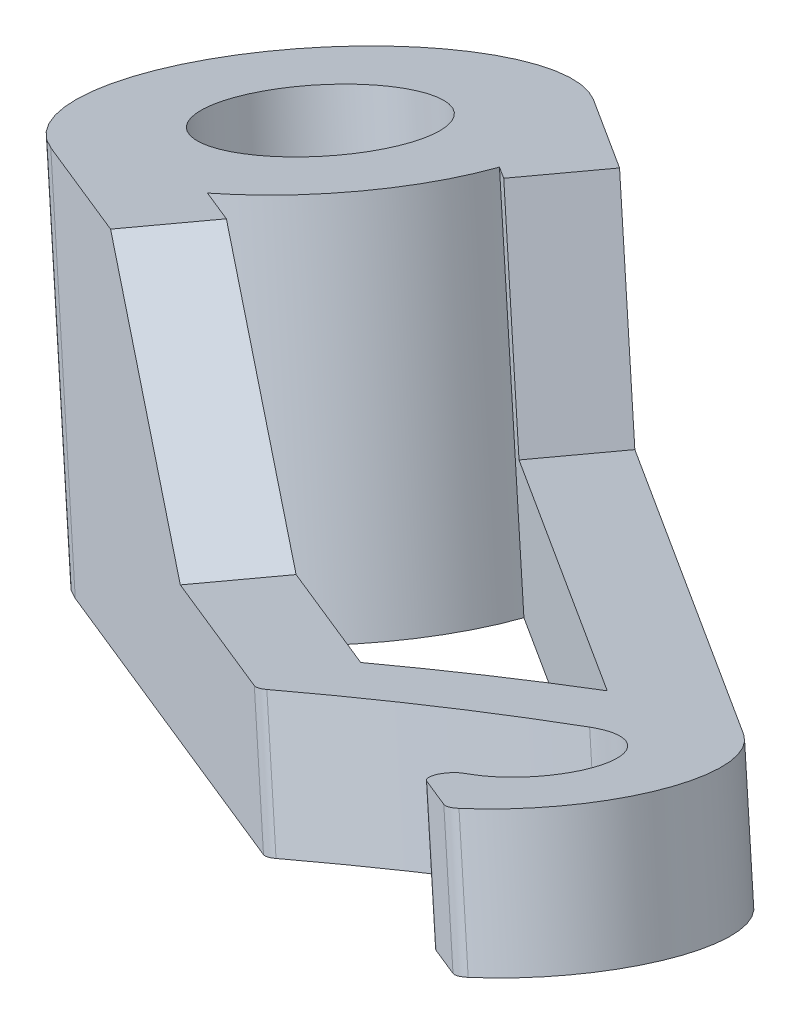
ISO-10303-21;
HEADER;
FILE_DESCRIPTION(('STEP AP214'),'2;1');
FILE_NAME('part.step','',(''),(''),'','','');
FILE_SCHEMA(('AUTOMOTIVE_DESIGN { 1 0 10303 214 1 1 1 1 }'));
ENDSEC;
DATA;
#1=APPLICATION_CONTEXT('core data for automotive mechanical design processes');
#2=APPLICATION_PROTOCOL_DEFINITION('international standard','automotive_design',2000,#1);
#3=PRODUCT_CONTEXT('',#1,'mechanical');
#4=PRODUCT('Part','Part','',(#3));
#5=PRODUCT_RELATED_PRODUCT_CATEGORY('part','',(#4));
#6=PRODUCT_DEFINITION_FORMATION('','',#4);
#7=PRODUCT_DEFINITION_CONTEXT('part definition',#1,'design');
#8=PRODUCT_DEFINITION('design','',#6,#7);
#9=PRODUCT_DEFINITION_SHAPE('','',#8);
#10=(LENGTH_UNIT() NAMED_UNIT(*) SI_UNIT(.MILLI.,.METRE.));
#11=(NAMED_UNIT(*) PLANE_ANGLE_UNIT() SI_UNIT($,.RADIAN.));
#12=(NAMED_UNIT(*) SI_UNIT($,.STERADIAN.) SOLID_ANGLE_UNIT());
#13=UNCERTAINTY_MEASURE_WITH_UNIT(LENGTH_MEASURE(1.E-05),#10,'distance_accuracy_value','');
#14=(GEOMETRIC_REPRESENTATION_CONTEXT(3) GLOBAL_UNCERTAINTY_ASSIGNED_CONTEXT((#13)) GLOBAL_UNIT_ASSIGNED_CONTEXT((#10,
#11,#12)) REPRESENTATION_CONTEXT('',''));
#15=CARTESIAN_POINT('',(0.,0.,0.));
#16=DIRECTION('',(0.,0.,1.));
#17=DIRECTION('',(1.,0.,0.));
#18=AXIS2_PLACEMENT_3D('',#15,#16,#17);
#19=CARTESIAN_POINT('',(-4.6893412063261,5.61280139034177,6.03908326318181));
#20=DIRECTION('',(0.275946414079952,-0.93969262078591,0.202067699043971));
#21=DIRECTION('',(0.959485309616609,0.28175865670804,0.));
#22=AXIS2_PLACEMENT_3D('',#19,#20,#21);
#23=CYLINDRICAL_SURFACE('',#22,8.54196324430797);
#24=CARTESIAN_POINT('',(-4.34440818872616,4.43818561435938,6.29166788698678));
#25=DIRECTION('',(-0.275946414079952,0.93969262078591,-0.202067699043971));
#26=DIRECTION('',(-0.959485309616609,-0.28175865670804,0.));
#27=AXIS2_PLACEMENT_3D('',#24,#25,#26);
#28=CIRCLE('',#27,8.54196324430797);
#29=CARTESIAN_POINT('',(-5.25117296309972,2.39888330321453,-1.95358285479318));
#30=VERTEX_POINT('',#29);
#31=CARTESIAN_POINT('',(-6.78262623869362,2.03906699651033,-1.53549371000427));
#32=VERTEX_POINT('',#31);
#33=EDGE_CURVE('E197',#30,#32,#28,.T.);
#34=ORIENTED_EDGE('',*,*,#33,.T.);
#35=DIRECTION('',(0.275946414079952,-0.93969262078591,0.202067699043971));
#36=VECTOR('',#35,1.);
#37=CARTESIAN_POINT('',(-7.12755925629356,3.21368277249272,-1.78807833380923));
#38=LINE('',#37,#36);
#39=CARTESIAN_POINT('',(-6.57566642813365,1.3342975309209,-1.38394293572129));
#40=VERTEX_POINT('',#39);
#41=EDGE_CURVE('E285',#32,#40,#38,.T.);
#42=ORIENTED_EDGE('',*,*,#41,.T.);
#43=CARTESIAN_POINT('',(-4.1374483781662,3.73341614876995,6.44321866126975));
#44=DIRECTION('',(-0.275946414079952,0.93969262078591,-0.202067699043971));
#45=DIRECTION('',(-0.959485309616609,-0.28175865670804,0.));
#46=AXIS2_PLACEMENT_3D('',#43,#44,#45);
#47=CIRCLE('',#46,8.54196324430797);
#48=CARTESIAN_POINT('',(-5.04421315253975,1.6941138376251,-1.80203208051021));
#49=VERTEX_POINT('',#48);
#50=EDGE_CURVE('E256',#49,#40,#47,.T.);
#51=ORIENTED_EDGE('',*,*,#50,.F.);
#52=DIRECTION('',(0.275946414079952,-0.93969262078591,0.202067699043971));
#53=VECTOR('',#52,1.);
#54=CARTESIAN_POINT('',(-5.59610598069966,3.57349907919692,-2.20616747859815));
#55=LINE('',#54,#53);
#56=EDGE_CURVE('E264',#30,#49,#55,.T.);
#57=ORIENTED_EDGE('',*,*,#56,.F.);
#58=EDGE_LOOP('',(#34,#42,#51,#57));
#59=FACE_BOUND('',#58,.T.);
#60=ADVANCED_FACE('F37',(#59),#23,.F.);
#61=CARTESIAN_POINT('',(-5.5518928281599,3.67293389041309,-1.80413539808794));
#62=DIRECTION('',(0.275946414079952,-0.93969262078591,0.202067699043971));
#63=DIRECTION('',(0.959485309616609,0.28175865670804,0.));
#64=AXIS2_PLACEMENT_3D('',#61,#62,#63);
#65=CYLINDRICAL_SURFACE('',#64,0.416499553779431);
#66=DIRECTION('',(0.275946414079952,-0.93969262078591,0.202067699043971));
#67=VECTOR('',#66,1.);
#68=CARTESIAN_POINT('',(-5.50767967562015,3.77236870162925,-1.40210331757773));
#69=LINE('',#68,#67);
#70=CARTESIAN_POINT('',(-5.16274665802021,2.59775292564687,-1.14951869377277));
#71=VERTEX_POINT('',#70);
#72=CARTESIAN_POINT('',(-4.95578684746025,1.89298346005744,-0.997967919489788));
#73=VERTEX_POINT('',#72);
#74=EDGE_CURVE('E266',#71,#73,#69,.T.);
#75=ORIENTED_EDGE('',*,*,#74,.F.);
#76=CARTESIAN_POINT('',(-5.20695981055996,2.4983181144307,-1.55155077428298));
#77=DIRECTION('',(-0.275946414079952,0.93969262078591,-0.202067699043971));
#78=DIRECTION('',(-0.959485309616609,-0.28175865670804,0.));
#79=AXIS2_PLACEMENT_3D('',#76,#77,#78);
#80=CIRCLE('',#79,0.416499553779431);
#81=EDGE_CURVE('E352',#71,#30,#80,.T.);
#82=ORIENTED_EDGE('',*,*,#81,.T.);
#83=ORIENTED_EDGE('',*,*,#56,.T.);
#84=CARTESIAN_POINT('',(-5.,1.79354864884127,-1.4));
#85=DIRECTION('',(-0.275946414079952,0.93969262078591,-0.202067699043971));
#86=DIRECTION('',(0.959485309616609,0.28175865670804,0.));
#87=AXIS2_PLACEMENT_3D('',#84,#85,#86);
#88=CIRCLE('',#87,0.416499553779431);
#89=EDGE_CURVE('E253',#73,#49,#88,.T.);
#90=ORIENTED_EDGE('',*,*,#89,.F.);
#91=EDGE_LOOP('',(#75,#82,#83,#90));
#92=FACE_BOUND('',#91,.T.);
#93=ADVANCED_FACE('F367',(#92),#65,.F.);
#94=CARTESIAN_POINT('',(-5.50767967562015,3.77236870162925,-1.40210331757773));
#95=DIRECTION('',(-0.106154141435565,-0.238739298311052,-0.965264132607249));
#96=DIRECTION('',(0.,0.970749170132312,-0.240095915599219));
#97=AXIS2_PLACEMENT_3D('',#94,#95,#96);
#98=PLANE('',#97);
#99=DIRECTION('',(0.95529308320143,0.244910852929093,-0.165631516641763));
#100=VECTOR('',#99,1.);
#101=CARTESIAN_POINT('',(-4.95578684746025,1.89298346005744,-0.997967919489788));
#102=LINE('',#101,#100);
#103=CARTESIAN_POINT('',(-4.99227579631677,1.88362869789692,-0.991641358514892));
#104=VERTEX_POINT('',#103);
#105=EDGE_CURVE('E251',#104,#73,#102,.T.);
#106=ORIENTED_EDGE('',*,*,#105,.F.);
#107=DIRECTION('',(0.275946414079952,-0.93969262078591,0.202067699043971));
#108=VECTOR('',#107,1.);
#109=CARTESIAN_POINT('',(-5.54416862447668,3.76301393946874,-1.39577675660283));
#110=LINE('',#109,#108);
#111=CARTESIAN_POINT('',(-5.19923560687674,2.58839816348635,-1.14319213279787));
#112=VERTEX_POINT('',#111);
#113=EDGE_CURVE('E12',#104,#112,#110,.F.);
#114=ORIENTED_EDGE('',*,*,#113,.T.);
#115=DIRECTION('',(0.95529308320143,0.244910852929093,-0.165631516641763));
#116=VECTOR('',#115,1.);
#117=CARTESIAN_POINT('',(-5.16274665802021,2.59775292564687,-1.14951869377277));
#118=LINE('',#117,#116);
#119=EDGE_CURVE('E312',#112,#71,#118,.T.);
#120=ORIENTED_EDGE('',*,*,#119,.T.);
#121=ORIENTED_EDGE('',*,*,#74,.T.);
#122=EDGE_LOOP('',(#106,#114,#120,#121));
#123=FACE_BOUND('',#122,.T.);
#124=ADVANCED_FACE('F371',(#123),#98,.T.);
#125=CARTESIAN_POINT('',(-5.24071782991251,3.94052830678506,-0.984663140552532));
#126=DIRECTION('',(-0.557739430019936,0.0146718646886425,0.829886416678569));
#127=DIRECTION('',(0.829975753276417,0.,0.557799470215995));
#128=AXIS2_PLACEMENT_3D('',#125,#126,#127);
#129=PLANE('',#128);
#130=DIRECTION('',(-0.78280285178163,-0.341705304066336,-0.520054978262376));
#131=VECTOR('',#130,1.);
#132=CARTESIAN_POINT('',(-4.68882500175261,2.06114306521324,-0.580527742464591));
#133=LINE('',#132,#131);
#134=CARTESIAN_POINT('',(-4.73215915963464,2.04222704879628,-0.609316784921538));
#135=VERTEX_POINT('',#134);
#136=CARTESIAN_POINT('',(-5.03743432517521,1.90896981419689,-0.812126303586311));
#137=VERTEX_POINT('',#136);
#138=EDGE_CURVE('E248',#135,#137,#133,.T.);
#139=ORIENTED_EDGE('',*,*,#138,.F.);
#140=DIRECTION('',(0.275946414079952,-0.93969262078591,0.202067699043971));
#141=VECTOR('',#140,1.);
#142=CARTESIAN_POINT('',(-5.28405198779455,3.9216122903681,-1.01345218300948));
#143=LINE('',#142,#141);
#144=CARTESIAN_POINT('',(-4.93911897019461,2.74699651438572,-0.760867559204516));
#145=VERTEX_POINT('',#144);
#146=EDGE_CURVE('E45',#135,#145,#143,.F.);
#147=ORIENTED_EDGE('',*,*,#146,.T.);
#148=DIRECTION('',(-0.78280285178163,-0.341705304066336,-0.520054978262376));
#149=VECTOR('',#148,1.);
#150=CARTESIAN_POINT('',(-4.89578481231257,2.76591253080267,-0.732078516747569));
#151=LINE('',#150,#149);
#152=CARTESIAN_POINT('',(-5.24439413573518,2.61373927978632,-0.963677077869289));
#153=VERTEX_POINT('',#152);
#154=EDGE_CURVE('E309',#145,#153,#151,.T.);
#155=ORIENTED_EDGE('',*,*,#154,.T.);
#156=DIRECTION('',(0.275946414079952,-0.93969262078591,0.202067699043971));
#157=VECTOR('',#156,1.);
#158=CARTESIAN_POINT('',(-5.58932715333512,3.7883550557687,-1.21626170167425));
#159=LINE('',#158,#157);
#160=EDGE_CURVE('E303',#153,#137,#159,.T.);
#161=ORIENTED_EDGE('',*,*,#160,.T.);
#162=EDGE_LOOP('',(#139,#147,#155,#161));
#163=FACE_BOUND('',#162,.T.);
#164=ADVANCED_FACE('F308',(#163),#129,.T.);
#165=CARTESIAN_POINT('',(-5.5518928281599,3.67293389041309,-1.80413539808794));
#166=DIRECTION('',(0.275946414079952,-0.93969262078591,0.202067699043971));
#167=DIRECTION('',(0.959485309616609,0.28175865670804,0.));
#168=AXIS2_PLACEMENT_3D('',#165,#166,#167);
#169=CYLINDRICAL_SURFACE('',#168,0.91649955377943);
#170=CARTESIAN_POINT('',(-5.20695981055996,2.4983181144307,-1.55155077428298));
#171=DIRECTION('',(-0.275946414079952,0.93969262078591,-0.202067699043971));
#172=DIRECTION('',(-0.959485309616609,-0.28175865670804,0.));
#173=AXIS2_PLACEMENT_3D('',#170,#171,#172);
#174=CIRCLE('',#173,0.91649955377943);
#175=CARTESIAN_POINT('',(-4.63520813791761,2.5122173303551,-2.26770597303898));
#176=VERTEX_POINT('',#175);
#177=CARTESIAN_POINT('',(-4.84371061687733,2.77580628426568,-0.757181986522246));
#178=VERTEX_POINT('',#177);
#179=EDGE_CURVE('E172',#176,#178,#174,.F.);
#180=ORIENTED_EDGE('',*,*,#179,.T.);
#181=DIRECTION('',(0.275946414079952,-0.93969262078591,0.202067699043971));
#182=VECTOR('',#181,1.);
#183=CARTESIAN_POINT('',(-5.18864363447727,3.95042206024806,-1.00976661032721));
#184=LINE('',#183,#182);
#185=CARTESIAN_POINT('',(-4.63675080631737,2.07103681867624,-0.605631212239268));
#186=VERTEX_POINT('',#185);
#187=EDGE_CURVE('E300',#178,#186,#184,.T.);
#188=ORIENTED_EDGE('',*,*,#187,.T.);
#189=CARTESIAN_POINT('',(-5.,1.79354864884127,-1.4));
#190=DIRECTION('',(0.275946414079952,-0.93969262078591,0.202067699043971));
#191=DIRECTION('',(-0.959485309616609,-0.28175865670804,0.));
#192=AXIS2_PLACEMENT_3D('',#189,#190,#191);
#193=CIRCLE('',#192,0.91649955377943);
#194=CARTESIAN_POINT('',(-4.42824832735765,1.80744786476567,-2.116155198756));
#195=VERTEX_POINT('',#194);
#196=EDGE_CURVE('E245',#195,#186,#193,.T.);
#197=ORIENTED_EDGE('',*,*,#196,.F.);
#198=DIRECTION('',(0.275946414079952,-0.93969262078591,0.202067699043971));
#199=VECTOR('',#198,1.);
#200=CARTESIAN_POINT('',(-4.98014115551755,3.68683310633749,-2.52029059684395));
#201=LINE('',#200,#199);
#202=EDGE_CURVE('E269',#176,#195,#201,.T.);
#203=ORIENTED_EDGE('',*,*,#202,.F.);
#204=EDGE_LOOP('',(#180,#188,#197,#203));
#205=FACE_BOUND('',#204,.T.);
#206=ADVANCED_FACE('F318',(#205),#169,.T.);
#207=CARTESIAN_POINT('',(-4.6893412063261,5.61280139034177,6.03908326318181));
#208=DIRECTION('',(0.275946414079952,-0.93969262078591,0.202067699043971));
#209=DIRECTION('',(0.959485309616609,0.28175865670804,0.));
#210=AXIS2_PLACEMENT_3D('',#207,#208,#209);
#211=CYLINDRICAL_SURFACE('',#210,9.04196324430798);
#212=CARTESIAN_POINT('',(-4.34440818872616,4.43818561435938,6.29166788698678));
#213=DIRECTION('',(-0.275946414079952,0.93969262078591,-0.202067699043971));
#214=DIRECTION('',(-0.959485309616609,-0.28175865670804,0.));
#215=AXIS2_PLACEMENT_3D('',#212,#213,#214);
#216=CIRCLE('',#215,9.04196324430798);
#217=CARTESIAN_POINT('',(-5.57590640669709,2.21081786946406,-2.38469911652056));
#218=VERTEX_POINT('',#217);
#219=CARTESIAN_POINT('',(-6.74114691236747,1.93829354223655,-2.06077381767373));
#220=VERTEX_POINT('',#219);
#221=EDGE_CURVE('E185',#218,#220,#216,.T.);
#222=ORIENTED_EDGE('',*,*,#221,.F.);
#223=DIRECTION('',(0.275946414079952,-0.93969262078591,0.202067699043971));
#224=VECTOR('',#223,1.);
#225=CARTESIAN_POINT('',(-5.92083942429703,3.38543364544645,-2.63728374032552));
#226=LINE('',#225,#224);
#227=CARTESIAN_POINT('',(-5.36894659613713,1.50604840387463,-2.23314834223758));
#228=VERTEX_POINT('',#227);
#229=EDGE_CURVE('E222',#218,#228,#226,.T.);
#230=ORIENTED_EDGE('',*,*,#229,.T.);
#231=CARTESIAN_POINT('',(-4.1374483781662,3.73341614876995,6.44321866126975));
#232=DIRECTION('',(-0.275946414079952,0.93969262078591,-0.202067699043971));
#233=DIRECTION('',(-0.959485309616609,-0.28175865670804,0.));
#234=AXIS2_PLACEMENT_3D('',#231,#232,#233);
#235=CIRCLE('',#234,9.04196324430798);
#236=CARTESIAN_POINT('',(-6.5341871018075,1.23352407664711,-1.90922304339075));
#237=VERTEX_POINT('',#236);
#238=EDGE_CURVE('E212',#228,#237,#235,.T.);
#239=ORIENTED_EDGE('',*,*,#238,.T.);
#240=DIRECTION('',(0.275946414079952,-0.93969262078591,0.202067699043971));
#241=VECTOR('',#240,1.);
#242=CARTESIAN_POINT('',(-7.08607992996741,3.11290931821893,-2.31335844147869));
#243=LINE('',#242,#241);
#244=EDGE_CURVE('E220',#220,#237,#243,.T.);
#245=ORIENTED_EDGE('',*,*,#244,.F.);
#246=EDGE_LOOP('',(#222,#230,#239,#245));
#247=FACE_BOUND('',#246,.T.);
#248=ADVANCED_FACE('F404',(#247),#211,.T.);
#249=CARTESIAN_POINT('',(-9.94464078527404,1.6912741627427,-5.02081960517815));
#250=DIRECTION('',(0.275946414079952,-0.93969262078591,0.202067699043971));
#251=DIRECTION('',(0.959485309616609,0.28175865670804,0.));
#252=AXIS2_PLACEMENT_3D('',#249,#250,#251);
#253=CYLINDRICAL_SURFACE('',#252,1.17341117996067);
#254=CARTESIAN_POINT('',(-9.39274795711414,-0.188111078829119,-4.6166842070902));
#255=DIRECTION('',(0.275946414079952,-0.93969262078591,0.202067699043971));
#256=DIRECTION('',(-0.959485309616609,-0.28175865670804,0.));
#257=AXIS2_PLACEMENT_3D('',#254,#255,#256);
#258=CIRCLE('',#257,1.17341117996067);
#259=CARTESIAN_POINT('',(-10.0472056398044,-0.170894948772595,-3.64288620766207));
#260=VERTEX_POINT('',#259);
#261=CARTESIAN_POINT('',(-8.66072380928655,-0.170315657880881,-5.5335908366045));
#262=VERTEX_POINT('',#261);
#263=EDGE_CURVE('E229',#260,#262,#258,.T.);
#264=ORIENTED_EDGE('',*,*,#263,.F.);
#265=DIRECTION('',(0.275946414079952,-0.93969262078591,0.202067699043971));
#266=VECTOR('',#265,1.);
#267=CARTESIAN_POINT('',(-10.5990984679643,1.70849029279922,-4.04702160575001));
#268=LINE('',#267,#266);
#269=CARTESIAN_POINT('',(-10.5990984679643,1.70849029279922,-4.04702160575001));
#270=VERTEX_POINT('',#269);
#271=EDGE_CURVE('E260',#270,#260,#268,.T.);
#272=ORIENTED_EDGE('',*,*,#271,.F.);
#273=CARTESIAN_POINT('',(-9.94464078527404,1.6912741627427,-5.02081960517815));
#274=DIRECTION('',(0.275946414079952,-0.93969262078591,0.202067699043971));
#275=DIRECTION('',(-0.959485309616609,-0.28175865670804,0.));
#276=AXIS2_PLACEMENT_3D('',#273,#274,#275);
#277=CIRCLE('',#276,1.17341117996067);
#278=CARTESIAN_POINT('',(-9.21261663744646,1.70906958369094,-5.93772623469244));
#279=VERTEX_POINT('',#278);
#280=EDGE_CURVE('E232',#270,#279,#277,.T.);
#281=ORIENTED_EDGE('',*,*,#280,.T.);
#282=DIRECTION('',(0.275946414079952,-0.93969262078591,0.202067699043971));
#283=VECTOR('',#282,1.);
#284=CARTESIAN_POINT('',(-9.21261663744646,1.70906958369094,-5.93772623469244));
#285=LINE('',#284,#283);
#286=EDGE_CURVE('E239',#279,#262,#285,.T.);
#287=ORIENTED_EDGE('',*,*,#286,.T.);
#288=EDGE_LOOP('',(#264,#272,#281,#287));
#289=FACE_BOUND('',#288,.T.);
#290=ADVANCED_FACE('F329',(#289),#253,.T.);
#291=CARTESIAN_POINT('',(-10.5990984679643,1.70849029279922,-4.04702160575001));
#292=DIRECTION('',(-0.557739430019936,0.0146718646886426,0.829886416678569));
#293=DIRECTION('',(0.829975753276417,0.,0.557799470215994));
#294=AXIS2_PLACEMENT_3D('',#291,#292,#293);
#295=PLANE('',#294);
#296=DIRECTION('',(-0.78280285178163,-0.341705304066336,-0.520054978262376));
#297=VECTOR('',#296,1.);
#298=CARTESIAN_POINT('',(-10.0472056398044,-0.170894948772595,-3.64288620766207));
#299=LINE('',#298,#297);
#300=CARTESIAN_POINT('',(-6.65998437185576,1.30767845022574,-1.39258617507571));
#301=VERTEX_POINT('',#300);
#302=EDGE_CURVE('E235',#301,#260,#299,.T.);
#303=ORIENTED_EDGE('',*,*,#302,.F.);
#304=DIRECTION('',(0.275946414079952,-0.93969262078591,0.202067699043971));
#305=VECTOR('',#304,1.);
#306=CARTESIAN_POINT('',(-7.21187720001567,3.18706369179756,-1.79672157316365));
#307=LINE('',#306,#305);
#308=CARTESIAN_POINT('',(-6.86694418241573,2.01244791581518,-1.54413694935869));
#309=VERTEX_POINT('',#308);
#310=EDGE_CURVE('E294',#301,#309,#307,.F.);
#311=ORIENTED_EDGE('',*,*,#310,.T.);
#312=DIRECTION('',(-0.78280285178163,-0.341705304066336,-0.520054978262376));
#313=VECTOR('',#312,1.);
#314=CARTESIAN_POINT('',(-10.2541654503644,0.533874516816838,-3.79443698194505));
#315=LINE('',#314,#313);
#316=CARTESIAN_POINT('',(-8.19892327742724,1.4310188616989,-2.42903709723831));
#317=VERTEX_POINT('',#316);
#318=EDGE_CURVE('E193',#309,#317,#315,.T.);
#319=ORIENTED_EDGE('',*,*,#318,.T.);
#320=DIRECTION('',(-0.748813741477248,0.422423611327083,-0.510721326329958));
#321=VECTOR('',#320,1.);
#322=CARTESIAN_POINT('',(-9.68012484523465,2.26659983560329,-3.43927660991103));
#323=LINE('',#322,#321);
#324=CARTESIAN_POINT('',(-9.52326143000759,2.17810945852421,-3.33228940195814));
#325=VERTEX_POINT('',#324);
#326=EDGE_CURVE('E282',#317,#325,#323,.T.);
#327=ORIENTED_EDGE('',*,*,#326,.T.);
#328=DIRECTION('',(-0.78280285178163,-0.341705304066336,-0.520054978262376));
#329=VECTOR('',#328,1.);
#330=CARTESIAN_POINT('',(-10.5990984679643,1.70849029279922,-4.04702160575001));
#331=LINE('',#330,#329);
#332=EDGE_CURVE('E237',#325,#270,#331,.T.);
#333=ORIENTED_EDGE('',*,*,#332,.T.);
#334=ORIENTED_EDGE('',*,*,#271,.T.);
#335=EDGE_LOOP('',(#303,#311,#319,#327,#333,#334));
#336=FACE_BOUND('',#335,.T.);
#337=ADVANCED_FACE('F332',(#336),#295,.T.);
#338=CARTESIAN_POINT('',(-4.98014115551755,3.68683310633749,-2.52029059684395));
#339=DIRECTION('',(0.623842827074579,0.015165545762768,-0.781402670413477));
#340=DIRECTION('',(-0.78149254479295,0.,-0.623914579436191));
#341=AXIS2_PLACEMENT_3D('',#338,#339,#340);
#342=PLANE('',#341);
#343=DIRECTION('',(-0.275946414079952,0.939692620785909,-0.202067699043971));
#344=VECTOR('',#343,1.);
#345=CARTESIAN_POINT('',(-8.39184014725785,2.09260442269279,-5.27500512969022));
#346=LINE('',#345,#344);
#347=CARTESIAN_POINT('',(-8.04690712965792,0.917988646710401,-5.02242050588526));
#348=VERTEX_POINT('',#347);
#349=CARTESIAN_POINT('',(-8.39184014725785,2.09260442269279,-5.27500512969022));
#350=VERTEX_POINT('',#349);
#351=EDGE_CURVE('E180',#348,#350,#346,.T.);
#352=ORIENTED_EDGE('',*,*,#351,.F.);
#353=DIRECTION('',(0.73121385631292,0.341683749485143,0.590405379103004));
#354=VECTOR('',#353,1.);
#355=CARTESIAN_POINT('',(-4.63520813791761,2.5122173303551,-2.26770597303898));
#356=LINE('',#355,#354);
#357=EDGE_CURVE('E166',#348,#176,#356,.T.);
#358=ORIENTED_EDGE('',*,*,#357,.T.);
#359=ORIENTED_EDGE('',*,*,#202,.T.);
#360=DIRECTION('',(0.73121385631292,0.341683749485143,0.590405379103004));
#361=VECTOR('',#360,1.);
#362=CARTESIAN_POINT('',(-4.42824832735765,1.80744786476567,-2.116155198756));
#363=LINE('',#362,#361);
#364=EDGE_CURVE('E242',#262,#195,#363,.T.);
#365=ORIENTED_EDGE('',*,*,#364,.F.);
#366=ORIENTED_EDGE('',*,*,#286,.F.);
#367=DIRECTION('',(0.73121385631292,0.341683749485143,0.590405379103004));
#368=VECTOR('',#367,1.);
#369=CARTESIAN_POINT('',(-4.98014115551755,3.68683310633749,-2.52029059684395));
#370=LINE('',#369,#368);
#371=EDGE_CURVE('E191',#279,#350,#370,.T.);
#372=ORIENTED_EDGE('',*,*,#371,.T.);
#373=EDGE_LOOP('',(#352,#358,#359,#365,#366,#372));
#374=FACE_BOUND('',#373,.T.);
#375=ADVANCED_FACE('F189',(#374),#342,.T.);
#376=CARTESIAN_POINT('',(-9.94464078527404,1.6912741627427,-5.02081960517815));
#377=DIRECTION('',(-0.275946414079952,0.93969262078591,-0.202067699043971));
#378=DIRECTION('',(-0.959485309616609,-0.28175865670804,0.));
#379=AXIS2_PLACEMENT_3D('',#376,#377,#378);
#380=PLANE('',#379);
#381=DIRECTION('',(-0.590806427595597,0.,0.806813339696196));
#382=VECTOR('',#381,1.);
#383=CARTESIAN_POINT('',(-6.91116516675307,2.09260442269279,-7.29703513855021));
#384=LINE('',#383,#382);
#385=CARTESIAN_POINT('',(-8.68753419087048,2.09260442269279,-4.87120129866847));
#386=VERTEX_POINT('',#385);
#387=EDGE_CURVE('E186',#350,#386,#384,.T.);
#388=ORIENTED_EDGE('',*,*,#387,.F.);
#389=ORIENTED_EDGE('',*,*,#371,.F.);
#390=ORIENTED_EDGE('',*,*,#280,.F.);
#391=ORIENTED_EDGE('',*,*,#332,.F.);
#392=DIRECTION('',(0.590806427595597,0.,-0.806813339696196));
#393=VECTOR('',#392,1.);
#394=CARTESIAN_POINT('',(-6.72162603133702,2.17810945852421,-7.15824102846908));
#395=LINE('',#394,#393);
#396=CARTESIAN_POINT('',(-9.22758603861135,2.17810945852421,-3.73606776125803));
#397=VERTEX_POINT('',#396);
#398=EDGE_CURVE('E277',#325,#397,#395,.T.);
#399=ORIENTED_EDGE('',*,*,#398,.T.);
#400=DIRECTION('',(-0.78280285178163,-0.341705304066336,-0.520054978262376));
#401=VECTOR('',#400,1.);
#402=CARTESIAN_POINT('',(-7.08607992996741,3.11290931821893,-2.31335844147869));
#403=LINE('',#402,#401);
#404=CARTESIAN_POINT('',(-9.56799994183853,2.0295136325817,-3.96222169598131));
#405=VERTEX_POINT('',#404);
#406=EDGE_CURVE('E207',#397,#405,#403,.T.);
#407=ORIENTED_EDGE('',*,*,#406,.T.);
#408=CARTESIAN_POINT('',(-9.94464078527404,1.6912741627427,-5.02081960517815));
#409=DIRECTION('',(-0.275946414079952,0.93969262078591,-0.202067699043971));
#410=DIRECTION('',(-0.959485309616609,-0.28175865670804,0.));
#411=AXIS2_PLACEMENT_3D('',#408,#409,#410);
#412=CIRCLE('',#411,1.17341117996067);
#413=CARTESIAN_POINT('',(-8.82188331671212,2.02982537021545,-4.97967906599999));
#414=VERTEX_POINT('',#413);
#415=EDGE_CURVE('E201',#405,#414,#412,.T.);
#416=ORIENTED_EDGE('',*,*,#415,.T.);
#417=DIRECTION('',(0.73121385631292,0.341683749485143,0.590405379103004));
#418=VECTOR('',#417,1.);
#419=CARTESIAN_POINT('',(-8.82188331671212,2.02982537021545,-4.97967906599999));
#420=LINE('',#419,#418);
#421=EDGE_CURVE('E203',#414,#386,#420,.T.);
#422=ORIENTED_EDGE('',*,*,#421,.T.);
#423=EDGE_LOOP('',(#388,#389,#390,#391,#399,#407,#416,#422));
#424=FACE_BOUND('',#423,.T.);
#425=CARTESIAN_POINT('',(-9.94464078527404,1.6912741627427,-5.02081960517815));
#426=DIRECTION('',(0.275946414079952,-0.93969262078591,0.202067699043971));
#427=DIRECTION('',(0.959485309616609,0.28175865670804,0.));
#428=AXIS2_PLACEMENT_3D('',#425,#426,#427);
#429=CIRCLE('',#428,0.573411179960669);
#430=CARTESIAN_POINT('',(-9.39446118173185,1.85283772654979,-5.02081960517815));
#431=VERTEX_POINT('',#430);
#432=EDGE_CURVE('E226',#431,#431,#429,.T.);
#433=ORIENTED_EDGE('',*,*,#432,.T.);
#434=EDGE_LOOP('',(#433));
#435=FACE_BOUND('',#434,.T.);
#436=ADVANCED_FACE('F326',(#424,#435),#380,.T.);
#437=CARTESIAN_POINT('',(-9.39274795711414,-0.188111078829119,-4.6166842070902));
#438=DIRECTION('',(-0.275946414079952,0.93969262078591,-0.202067699043971));
#439=DIRECTION('',(-0.959485309616609,-0.28175865670804,0.));
#440=AXIS2_PLACEMENT_3D('',#437,#438,#439);
#441=PLANE('',#440);
#442=DIRECTION('',(0.73121385631292,0.341683749485143,0.590405379103004));
#443=VECTOR('',#442,1.);
#444=CARTESIAN_POINT('',(-8.26999048855222,0.150440128643633,-4.57554366791205));
#445=LINE('',#444,#443);
#446=CARTESIAN_POINT('',(-8.26999048855222,0.150440128643633,-4.57554366791205));
#447=VERTEX_POINT('',#446);
#448=EDGE_CURVE('E195',#447,#228,#445,.T.);
#449=ORIENTED_EDGE('',*,*,#448,.F.);
#450=CARTESIAN_POINT('',(-9.39274795711414,-0.188111078829119,-4.6166842070902));
#451=DIRECTION('',(-0.275946414079952,0.93969262078591,-0.202067699043971));
#452=DIRECTION('',(-0.959485309616609,-0.28175865670804,0.));
#453=AXIS2_PLACEMENT_3D('',#450,#451,#452);
#454=CIRCLE('',#453,1.17341117996067);
#455=CARTESIAN_POINT('',(-9.01610711367862,0.150128391009876,-3.55808629789337));
#456=VERTEX_POINT('',#455);
#457=EDGE_CURVE('E192',#456,#447,#454,.T.);
#458=ORIENTED_EDGE('',*,*,#457,.F.);
#459=DIRECTION('',(-0.78280285178163,-0.341705304066336,-0.520054978262376));
#460=VECTOR('',#459,1.);
#461=CARTESIAN_POINT('',(-6.5341871018075,1.23352407664711,-1.90922304339075));
#462=LINE('',#461,#460);
#463=EDGE_CURVE('E204',#237,#456,#462,.T.);
#464=ORIENTED_EDGE('',*,*,#463,.F.);
#465=ORIENTED_EDGE('',*,*,#238,.F.);
#466=EDGE_LOOP('',(#449,#458,#464,#465));
#467=FACE_BOUND('',#466,.T.);
#468=CARTESIAN_POINT('',(-9.39274795711414,-0.188111078829119,-4.6166842070902));
#469=DIRECTION('',(0.275946414079952,-0.93969262078591,0.202067699043971));
#470=DIRECTION('',(0.959485309616609,0.28175865670804,0.));
#471=AXIS2_PLACEMENT_3D('',#468,#469,#470);
#472=CIRCLE('',#471,0.573411179960669);
#473=CARTESIAN_POINT('',(-8.84256835357195,-0.026547515022028,-4.6166842070902));
#474=VERTEX_POINT('',#473);
#475=EDGE_CURVE('E219',#474,#474,#472,.T.);
#476=ORIENTED_EDGE('',*,*,#475,.F.);
#477=EDGE_LOOP('',(#476));
#478=FACE_BOUND('',#477,.T.);
#479=ORIENTED_EDGE('',*,*,#50,.T.);
#480=CARTESIAN_POINT('',(-6.60421042885377,1.30621126375688,-1.47557481674357));
#481=DIRECTION('',(-0.275946414079952,0.93969262078591,-0.202067699043971));
#482=DIRECTION('',(-0.959485309616609,-0.28175865670804,0.));
#483=AXIS2_PLACEMENT_3D('',#480,#481,#482);
#484=CIRCLE('',#483,0.1);
#485=EDGE_CURVE('E292',#40,#301,#484,.F.);
#486=ORIENTED_EDGE('',*,*,#485,.T.);
#487=ORIENTED_EDGE('',*,*,#302,.T.);
#488=ORIENTED_EDGE('',*,*,#263,.T.);
#489=ORIENTED_EDGE('',*,*,#364,.T.);
#490=ORIENTED_EDGE('',*,*,#196,.T.);
#491=CARTESIAN_POINT('',(-4.67638521663265,2.04075986232742,-0.692305426589394));
#492=DIRECTION('',(-0.275946414079952,0.93969262078591,-0.202067699043971));
#493=DIRECTION('',(-0.959485309616609,-0.28175865670804,0.));
#494=AXIS2_PLACEMENT_3D('',#491,#492,#493);
#495=CIRCLE('',#494,0.1);
#496=EDGE_CURVE('E290',#186,#135,#495,.F.);
#497=ORIENTED_EDGE('',*,*,#496,.T.);
#498=ORIENTED_EDGE('',*,*,#138,.T.);
#499=CARTESIAN_POINT('',(-4.98166038217322,1.90750262772802,-0.895114945254167));
#500=DIRECTION('',(-0.275946414079952,0.93969262078591,-0.202067699043971));
#501=DIRECTION('',(-0.959485309616609,-0.28175865670804,0.));
#502=AXIS2_PLACEMENT_3D('',#499,#500,#501);
#503=CIRCLE('',#502,0.1);
#504=EDGE_CURVE('E288',#137,#104,#503,.F.);
#505=ORIENTED_EDGE('',*,*,#504,.T.);
#506=ORIENTED_EDGE('',*,*,#105,.T.);
#507=ORIENTED_EDGE('',*,*,#89,.T.);
#508=EDGE_LOOP('',(#479,#486,#487,#488,#489,#490,#497,#498,#505,#506,#507));
#509=FACE_BOUND('',#508,.T.);
#510=ADVANCED_FACE('F320',(#467,#478,#509),#441,.F.);
#511=CARTESIAN_POINT('',(-9.94464078527404,1.6912741627427,-5.02081960517815));
#512=DIRECTION('',(0.275946414079952,-0.93969262078591,0.202067699043971));
#513=DIRECTION('',(0.959485309616609,0.28175865670804,0.));
#514=AXIS2_PLACEMENT_3D('',#511,#512,#513);
#515=CYLINDRICAL_SURFACE('',#514,0.573411179960669);
#516=ORIENTED_EDGE('',*,*,#432,.F.);
#517=EDGE_LOOP('',(#516));
#518=FACE_BOUND('',#517,.T.);
#519=ORIENTED_EDGE('',*,*,#475,.T.);
#520=EDGE_LOOP('',(#519));
#521=FACE_BOUND('',#520,.T.);
#522=ADVANCED_FACE('F389',(#518,#521),#515,.F.);
#523=CARTESIAN_POINT('',(-9.94464078527404,1.6912741627427,-5.02081960517815));
#524=DIRECTION('',(0.275946414079952,-0.93969262078591,0.202067699043971));
#525=DIRECTION('',(0.959485309616609,0.28175865670804,0.));
#526=AXIS2_PLACEMENT_3D('',#523,#524,#525);
#527=CYLINDRICAL_SURFACE('',#526,1.17341117996067);
#528=ORIENTED_EDGE('',*,*,#457,.T.);
#529=DIRECTION('',(0.275946414079952,-0.93969262078591,0.202067699043971));
#530=VECTOR('',#529,1.);
#531=CARTESIAN_POINT('',(-8.82188331671212,2.02982537021545,-4.97967906599999));
#532=LINE('',#531,#530);
#533=EDGE_CURVE('E208',#414,#447,#532,.T.);
#534=ORIENTED_EDGE('',*,*,#533,.F.);
#535=ORIENTED_EDGE('',*,*,#415,.F.);
#536=DIRECTION('',(0.275946414079952,-0.93969262078591,0.202067699043971));
#537=VECTOR('',#536,1.);
#538=CARTESIAN_POINT('',(-9.56799994183853,2.0295136325817,-3.96222169598131));
#539=LINE('',#538,#537);
#540=EDGE_CURVE('E217',#405,#456,#539,.T.);
#541=ORIENTED_EDGE('',*,*,#540,.T.);
#542=EDGE_LOOP('',(#528,#534,#535,#541));
#543=FACE_BOUND('',#542,.T.);
#544=ADVANCED_FACE('F395',(#543),#527,.T.);
#545=CARTESIAN_POINT('',(-7.08607992996741,3.11290931821893,-2.31335844147869));
#546=DIRECTION('',(-0.557739430019936,0.0146718646886423,0.829886416678569));
#547=DIRECTION('',(0.829975753276417,0.,0.557799470215995));
#548=AXIS2_PLACEMENT_3D('',#545,#546,#547);
#549=PLANE('',#548);
#550=ORIENTED_EDGE('',*,*,#406,.F.);
#551=DIRECTION('',(0.748813741477248,-0.422423611327083,0.510721326329958));
#552=VECTOR('',#551,1.);
#553=CARTESIAN_POINT('',(-7.7783950784649,1.36058642845809,-2.74766078062322));
#554=LINE('',#553,#552);
#555=CARTESIAN_POINT('',(-7.903247886031,1.4310188616989,-2.8328154565382));
#556=VERTEX_POINT('',#555);
#557=EDGE_CURVE('E280',#397,#556,#554,.T.);
#558=ORIENTED_EDGE('',*,*,#557,.T.);
#559=DIRECTION('',(-0.78280285178163,-0.341705304066336,-0.520054978262376));
#560=VECTOR('',#559,1.);
#561=CARTESIAN_POINT('',(-6.74114691236747,1.93829354223655,-2.06077381767373));
#562=LINE('',#561,#560);
#563=EDGE_CURVE('E176',#220,#556,#562,.T.);
#564=ORIENTED_EDGE('',*,*,#563,.F.);
#565=ORIENTED_EDGE('',*,*,#244,.T.);
#566=ORIENTED_EDGE('',*,*,#463,.T.);
#567=ORIENTED_EDGE('',*,*,#540,.F.);
#568=EDGE_LOOP('',(#550,#558,#564,#565,#566,#567));
#569=FACE_BOUND('',#568,.T.);
#570=ADVANCED_FACE('F344',(#569),#549,.F.);
#571=CARTESIAN_POINT('',(-8.82188331671212,2.02982537021545,-4.97967906599999));
#572=DIRECTION('',(0.62384282707458,0.0151655457627682,-0.781402670413477));
#573=DIRECTION('',(-0.78149254479295,0.,-0.623914579436191));
#574=AXIS2_PLACEMENT_3D('',#571,#572,#573);
#575=PLANE('',#574);
#576=DIRECTION('',(0.73121385631292,0.341683749485143,0.590405379103004));
#577=VECTOR('',#576,1.);
#578=CARTESIAN_POINT('',(-8.47695029911218,0.855209594233066,-4.72709444219502));
#579=LINE('',#578,#577);
#580=CARTESIAN_POINT('',(-8.34260117327054,0.917988646710399,-4.61861667486352));
#581=VERTEX_POINT('',#580);
#582=EDGE_CURVE('E263',#581,#218,#579,.T.);
#583=ORIENTED_EDGE('',*,*,#582,.F.);
#584=DIRECTION('',(-0.275946414079952,0.939692620785909,-0.202067699043971));
#585=VECTOR('',#584,1.);
#586=CARTESIAN_POINT('',(-8.68753419087048,2.09260442269279,-4.87120129866847));
#587=LINE('',#586,#585);
#588=EDGE_CURVE('E183',#581,#386,#587,.T.);
#589=ORIENTED_EDGE('',*,*,#588,.T.);
#590=ORIENTED_EDGE('',*,*,#421,.F.);
#591=ORIENTED_EDGE('',*,*,#533,.T.);
#592=ORIENTED_EDGE('',*,*,#448,.T.);
#593=ORIENTED_EDGE('',*,*,#229,.F.);
#594=EDGE_LOOP('',(#583,#589,#590,#591,#592,#593));
#595=FACE_BOUND('',#594,.T.);
#596=ADVANCED_FACE('F400',(#595),#575,.F.);
#597=CARTESIAN_POINT('',(-3.01125232429113,-11.1879425704197,-4.44124004813099));
#598=DIRECTION('',(-0.75815654166415,-0.342020143325666,-0.555176440324467));
#599=DIRECTION('',(-0.590806427595597,0.,0.806813339696196));
#600=AXIS2_PLACEMENT_3D('',#597,#598,#599);
#601=PLANE('',#600);
#602=ORIENTED_EDGE('',*,*,#351,.T.);
#603=ORIENTED_EDGE('',*,*,#387,.T.);
#604=ORIENTED_EDGE('',*,*,#588,.F.);
#605=DIRECTION('',(0.590806427595597,0.,-0.806813339696196));
#606=VECTOR('',#605,1.);
#607=CARTESIAN_POINT('',(-6.56623214915313,0.9179886467104,-7.04445051474525));
#608=LINE('',#607,#606);
#609=EDGE_CURVE('E170',#581,#348,#608,.T.);
#610=ORIENTED_EDGE('',*,*,#609,.T.);
#611=EDGE_LOOP('',(#602,#603,#604,#610));
#612=FACE_BOUND('',#611,.T.);
#613=ADVANCED_FACE('F179',(#612),#601,.F.);
#614=CARTESIAN_POINT('',(-9.5997077676741,0.516658386760314,-4.76823498137318));
#615=DIRECTION('',(-0.275946414079952,0.93969262078591,-0.202067699043971));
#616=DIRECTION('',(-0.959485309616609,-0.28175865670804,0.));
#617=AXIS2_PLACEMENT_3D('',#614,#615,#616);
#618=PLANE('',#617);
#619=ORIENTED_EDGE('',*,*,#318,.F.);
#620=CARTESIAN_POINT('',(-6.81117023941373,2.01098072934631,-1.62712559102655));
#621=DIRECTION('',(-0.275946414079952,0.93969262078591,-0.202067699043971));
#622=DIRECTION('',(-0.959485309616609,-0.28175865670804,0.));
#623=AXIS2_PLACEMENT_3D('',#620,#621,#622);
#624=CIRCLE('',#623,0.1);
#625=EDGE_CURVE('E298',#309,#32,#624,.T.);
#626=ORIENTED_EDGE('',*,*,#625,.T.);
#627=ORIENTED_EDGE('',*,*,#33,.F.);
#628=ORIENTED_EDGE('',*,*,#81,.F.);
#629=ORIENTED_EDGE('',*,*,#119,.F.);
#630=CARTESIAN_POINT('',(-5.18862019273318,2.61227209331745,-1.04666571953715));
#631=DIRECTION('',(-0.275946414079952,0.93969262078591,-0.202067699043971));
#632=DIRECTION('',(-0.959485309616609,-0.28175865670804,0.));
#633=AXIS2_PLACEMENT_3D('',#630,#631,#632);
#634=CIRCLE('',#633,0.1);
#635=EDGE_CURVE('E58',#112,#153,#634,.T.);
#636=ORIENTED_EDGE('',*,*,#635,.T.);
#637=ORIENTED_EDGE('',*,*,#154,.F.);
#638=CARTESIAN_POINT('',(-4.88334502719261,2.74552932791685,-0.843856200872372));
#639=DIRECTION('',(-0.275946414079952,0.93969262078591,-0.202067699043971));
#640=DIRECTION('',(-0.959485309616609,-0.28175865670804,0.));
#641=AXIS2_PLACEMENT_3D('',#638,#639,#640);
#642=CIRCLE('',#641,0.1);
#643=EDGE_CURVE('E52',#145,#178,#642,.T.);
#644=ORIENTED_EDGE('',*,*,#643,.T.);
#645=ORIENTED_EDGE('',*,*,#179,.F.);
#646=ORIENTED_EDGE('',*,*,#357,.F.);
#647=ORIENTED_EDGE('',*,*,#609,.F.);
#648=ORIENTED_EDGE('',*,*,#582,.T.);
#649=ORIENTED_EDGE('',*,*,#221,.T.);
#650=ORIENTED_EDGE('',*,*,#563,.T.);
#651=DIRECTION('',(-0.590806427595597,0.,0.806813339696196));
#652=VECTOR('',#651,1.);
#653=CARTESIAN_POINT('',(-7.57284359302883,1.4310188616989,-3.28402007895898));
#654=LINE('',#653,#652);
#655=EDGE_CURVE('E274',#556,#317,#654,.T.);
#656=ORIENTED_EDGE('',*,*,#655,.T.);
#657=EDGE_LOOP('',(#619,#626,#627,#628,#629,#636,#637,#644,#645,#646,#647,#648,#649,#650,#656));
#658=FACE_BOUND('',#657,.T.);
#659=ADVANCED_FACE('F169',(#658),#618,.T.);
#660=CARTESIAN_POINT('',(-6.98015177027307,2.32752757788929,-7.34755206331121));
#661=DIRECTION('',(-0.340974051171621,-0.906307787036647,-0.249685585455688));
#662=DIRECTION('',(0.590806427595597,0.,-0.806813339696196));
#663=AXIS2_PLACEMENT_3D('',#660,#661,#662);
#664=PLANE('',#663);
#665=ORIENTED_EDGE('',*,*,#326,.F.);
#666=ORIENTED_EDGE('',*,*,#655,.F.);
#667=ORIENTED_EDGE('',*,*,#557,.F.);
#668=ORIENTED_EDGE('',*,*,#398,.F.);
#669=EDGE_LOOP('',(#665,#666,#667,#668));
#670=FACE_BOUND('',#669,.T.);
#671=ADVANCED_FACE('F340',(#670),#664,.F.);
#672=CARTESIAN_POINT('',(-7.15610325701367,3.1855965053287,-1.87971021483151));
#673=DIRECTION('',(0.275946414079952,-0.93969262078591,0.202067699043971));
#674=DIRECTION('',(0.959485309616609,0.28175865670804,0.));
#675=AXIS2_PLACEMENT_3D('',#672,#673,#674);
#676=CYLINDRICAL_SURFACE('',#675,0.1);
#677=ORIENTED_EDGE('',*,*,#625,.F.);
#678=ORIENTED_EDGE('',*,*,#310,.F.);
#679=ORIENTED_EDGE('',*,*,#485,.F.);
#680=ORIENTED_EDGE('',*,*,#41,.F.);
#681=EDGE_LOOP('',(#677,#678,#679,#680));
#682=FACE_BOUND('',#681,.T.);
#683=ADVANCED_FACE('F362',(#682),#676,.T.);
#684=CARTESIAN_POINT('',(-5.22827804479255,3.92014510389924,-1.09644082467734));
#685=DIRECTION('',(0.275946414079952,-0.93969262078591,0.202067699043971));
#686=DIRECTION('',(0.959485309616609,0.28175865670804,0.));
#687=AXIS2_PLACEMENT_3D('',#684,#685,#686);
#688=CYLINDRICAL_SURFACE('',#687,0.1);
#689=ORIENTED_EDGE('',*,*,#643,.F.);
#690=ORIENTED_EDGE('',*,*,#146,.F.);
#691=ORIENTED_EDGE('',*,*,#496,.F.);
#692=ORIENTED_EDGE('',*,*,#187,.F.);
#693=EDGE_LOOP('',(#689,#690,#691,#692));
#694=FACE_BOUND('',#693,.T.);
#695=ADVANCED_FACE('F315',(#694),#688,.T.);
#696=CARTESIAN_POINT('',(-5.53355321033312,3.78688786929984,-1.29925034334211));
#697=DIRECTION('',(0.275946414079952,-0.93969262078591,0.202067699043971));
#698=DIRECTION('',(0.959485309616609,0.28175865670804,0.));
#699=AXIS2_PLACEMENT_3D('',#696,#697,#698);
#700=CYLINDRICAL_SURFACE('',#699,0.1);
#701=ORIENTED_EDGE('',*,*,#635,.F.);
#702=ORIENTED_EDGE('',*,*,#113,.F.);
#703=ORIENTED_EDGE('',*,*,#504,.F.);
#704=ORIENTED_EDGE('',*,*,#160,.F.);
#705=EDGE_LOOP('',(#701,#702,#703,#704));
#706=FACE_BOUND('',#705,.T.);
#707=ADVANCED_FACE('F39',(#706),#700,.T.);
#708=CLOSED_SHELL('',(#60,#93,#124,#164,#206,#248,#290,#337,#375,#436,#510,#522,#544,#570,#596,
#613,#659,#671,#683,#695,#707));
#709=MANIFOLD_SOLID_BREP('B2',#708);
#710=ADVANCED_BREP_SHAPE_REPRESENTATION('',(#18,#709),#14);
#711=SHAPE_DEFINITION_REPRESENTATION(#9,#710);
ENDSEC;
END-ISO-10303-21;
